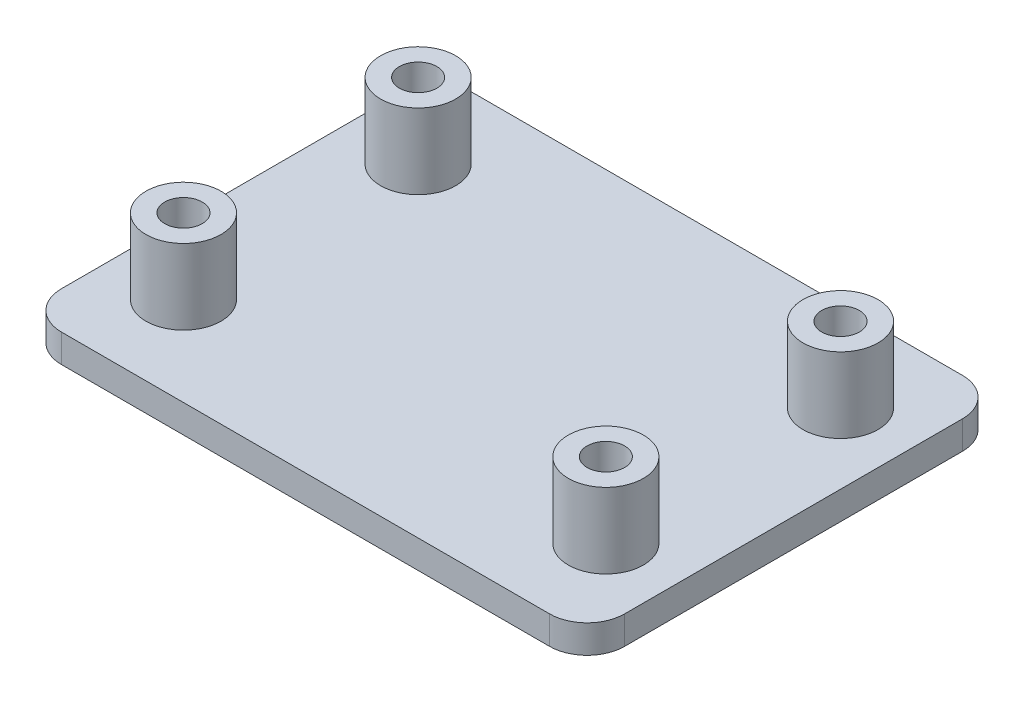
ISO-10303-21;
HEADER;
FILE_DESCRIPTION(('STEP AP214'),'2;1');
FILE_NAME('part.step','',(''),(''),'','','');
FILE_SCHEMA(('AUTOMOTIVE_DESIGN { 1 0 10303 214 1 1 1 1 }'));
ENDSEC;
DATA;
#1=APPLICATION_CONTEXT('core data for automotive mechanical design processes');
#2=APPLICATION_PROTOCOL_DEFINITION('international standard','automotive_design',2000,#1);
#3=PRODUCT_CONTEXT('',#1,'mechanical');
#4=PRODUCT('Part','Part','',(#3));
#5=PRODUCT_RELATED_PRODUCT_CATEGORY('part','',(#4));
#6=PRODUCT_DEFINITION_FORMATION('','',#4);
#7=PRODUCT_DEFINITION_CONTEXT('part definition',#1,'design');
#8=PRODUCT_DEFINITION('design','',#6,#7);
#9=PRODUCT_DEFINITION_SHAPE('','',#8);
#10=(LENGTH_UNIT() NAMED_UNIT(*) SI_UNIT(.MILLI.,.METRE.));
#11=(NAMED_UNIT(*) PLANE_ANGLE_UNIT() SI_UNIT($,.RADIAN.));
#12=(NAMED_UNIT(*) SI_UNIT($,.STERADIAN.) SOLID_ANGLE_UNIT());
#13=UNCERTAINTY_MEASURE_WITH_UNIT(LENGTH_MEASURE(1.E-05),#10,'distance_accuracy_value','');
#14=(GEOMETRIC_REPRESENTATION_CONTEXT(3) GLOBAL_UNCERTAINTY_ASSIGNED_CONTEXT((#13)) GLOBAL_UNIT_ASSIGNED_CONTEXT((#10,
#11,#12)) REPRESENTATION_CONTEXT('',''));
#15=CARTESIAN_POINT('',(0.,0.,0.));
#16=DIRECTION('',(0.,0.,1.));
#17=DIRECTION('',(1.,0.,0.));
#18=AXIS2_PLACEMENT_3D('',#15,#16,#17);
#19=CARTESIAN_POINT('',(-26.,3.,18.));
#20=DIRECTION('',(0.,-1.,0.));
#21=DIRECTION('',(0.,0.,-1.));
#22=AXIS2_PLACEMENT_3D('',#19,#20,#21);
#23=CYLINDRICAL_SURFACE('',#22,4.);
#24=CARTESIAN_POINT('',(-26.,0.,18.));
#25=DIRECTION('',(0.,1.,0.));
#26=DIRECTION('',(0.,0.,1.));
#27=AXIS2_PLACEMENT_3D('',#24,#25,#26);
#28=CIRCLE('',#27,4.);
#29=CARTESIAN_POINT('',(-30.,0.,18.));
#30=VERTEX_POINT('',#29);
#31=CARTESIAN_POINT('',(-26.,0.,22.));
#32=VERTEX_POINT('',#31);
#33=EDGE_CURVE('E135',#30,#32,#28,.T.);
#34=ORIENTED_EDGE('',*,*,#33,.T.);
#35=DIRECTION('',(0.,-1.,0.));
#36=VECTOR('',#35,1.);
#37=CARTESIAN_POINT('',(-26.,3.,22.));
#38=LINE('',#37,#36);
#39=CARTESIAN_POINT('',(-26.,3.,22.));
#40=VERTEX_POINT('',#39);
#41=EDGE_CURVE('E11',#40,#32,#38,.T.);
#42=ORIENTED_EDGE('',*,*,#41,.F.);
#43=CARTESIAN_POINT('',(-26.,3.,18.));
#44=DIRECTION('',(0.,1.,0.));
#45=DIRECTION('',(0.,0.,1.));
#46=AXIS2_PLACEMENT_3D('',#43,#44,#45);
#47=CIRCLE('',#46,4.);
#48=CARTESIAN_POINT('',(-30.,3.,18.));
#49=VERTEX_POINT('',#48);
#50=EDGE_CURVE('E150',#49,#40,#47,.T.);
#51=ORIENTED_EDGE('',*,*,#50,.F.);
#52=DIRECTION('',(0.,-1.,0.));
#53=VECTOR('',#52,1.);
#54=CARTESIAN_POINT('',(-30.,3.,18.));
#55=LINE('',#54,#53);
#56=EDGE_CURVE('E131',#49,#30,#55,.T.);
#57=ORIENTED_EDGE('',*,*,#56,.T.);
#58=EDGE_LOOP('',(#34,#42,#51,#57));
#59=FACE_BOUND('',#58,.T.);
#60=ADVANCED_FACE('F39',(#59),#23,.T.);
#61=CARTESIAN_POINT('',(-26.,3.,22.));
#62=DIRECTION('',(0.,0.,-1.));
#63=DIRECTION('',(-1.,0.,0.));
#64=AXIS2_PLACEMENT_3D('',#61,#62,#63);
#65=PLANE('',#64);
#66=DIRECTION('',(1.,0.,0.));
#67=VECTOR('',#66,1.);
#68=CARTESIAN_POINT('',(-26.,0.,22.));
#69=LINE('',#68,#67);
#70=CARTESIAN_POINT('',(26.,0.,22.));
#71=VERTEX_POINT('',#70);
#72=EDGE_CURVE('E138',#32,#71,#69,.T.);
#73=ORIENTED_EDGE('',*,*,#72,.T.);
#74=DIRECTION('',(0.,-1.,0.));
#75=VECTOR('',#74,1.);
#76=CARTESIAN_POINT('',(26.,3.,22.));
#77=LINE('',#76,#75);
#78=CARTESIAN_POINT('',(26.,3.,22.));
#79=VERTEX_POINT('',#78);
#80=EDGE_CURVE('E47',#79,#71,#77,.T.);
#81=ORIENTED_EDGE('',*,*,#80,.F.);
#82=DIRECTION('',(1.,0.,0.));
#83=VECTOR('',#82,1.);
#84=CARTESIAN_POINT('',(-26.,3.,22.));
#85=LINE('',#84,#83);
#86=EDGE_CURVE('E98',#40,#79,#85,.T.);
#87=ORIENTED_EDGE('',*,*,#86,.F.);
#88=ORIENTED_EDGE('',*,*,#41,.T.);
#89=EDGE_LOOP('',(#73,#81,#87,#88));
#90=FACE_BOUND('',#89,.T.);
#91=ADVANCED_FACE('F267',(#90),#65,.F.);
#92=CARTESIAN_POINT('',(26.,3.,18.));
#93=DIRECTION('',(0.,-1.,0.));
#94=DIRECTION('',(0.,0.,-1.));
#95=AXIS2_PLACEMENT_3D('',#92,#93,#94);
#96=CYLINDRICAL_SURFACE('',#95,4.);
#97=CARTESIAN_POINT('',(26.,0.,18.));
#98=DIRECTION('',(0.,1.,0.));
#99=DIRECTION('',(0.,0.,1.));
#100=AXIS2_PLACEMENT_3D('',#97,#98,#99);
#101=CIRCLE('',#100,4.);
#102=CARTESIAN_POINT('',(30.,0.,18.));
#103=VERTEX_POINT('',#102);
#104=EDGE_CURVE('E141',#71,#103,#101,.T.);
#105=ORIENTED_EDGE('',*,*,#104,.T.);
#106=DIRECTION('',(0.,-1.,0.));
#107=VECTOR('',#106,1.);
#108=CARTESIAN_POINT('',(30.,3.,18.));
#109=LINE('',#108,#107);
#110=CARTESIAN_POINT('',(30.,3.,18.));
#111=VERTEX_POINT('',#110);
#112=EDGE_CURVE('E157',#111,#103,#109,.T.);
#113=ORIENTED_EDGE('',*,*,#112,.F.);
#114=CARTESIAN_POINT('',(26.,3.,18.));
#115=DIRECTION('',(0.,1.,0.));
#116=DIRECTION('',(0.,0.,1.));
#117=AXIS2_PLACEMENT_3D('',#114,#115,#116);
#118=CIRCLE('',#117,4.);
#119=EDGE_CURVE('E165',#79,#111,#118,.T.);
#120=ORIENTED_EDGE('',*,*,#119,.F.);
#121=ORIENTED_EDGE('',*,*,#80,.T.);
#122=EDGE_LOOP('',(#105,#113,#120,#121));
#123=FACE_BOUND('',#122,.T.);
#124=ADVANCED_FACE('F163',(#123),#96,.T.);
#125=CARTESIAN_POINT('',(30.,3.,18.));
#126=DIRECTION('',(-1.,0.,0.));
#127=DIRECTION('',(0.,0.,1.));
#128=AXIS2_PLACEMENT_3D('',#125,#126,#127);
#129=PLANE('',#128);
#130=DIRECTION('',(0.,0.,-1.));
#131=VECTOR('',#130,1.);
#132=CARTESIAN_POINT('',(30.,0.,18.));
#133=LINE('',#132,#131);
#134=CARTESIAN_POINT('',(30.,0.,-18.));
#135=VERTEX_POINT('',#134);
#136=EDGE_CURVE('E143',#103,#135,#133,.T.);
#137=ORIENTED_EDGE('',*,*,#136,.T.);
#138=DIRECTION('',(0.,-1.,0.));
#139=VECTOR('',#138,1.);
#140=CARTESIAN_POINT('',(30.,3.,-18.));
#141=LINE('',#140,#139);
#142=CARTESIAN_POINT('',(30.,3.,-18.));
#143=VERTEX_POINT('',#142);
#144=EDGE_CURVE('E154',#143,#135,#141,.T.);
#145=ORIENTED_EDGE('',*,*,#144,.F.);
#146=DIRECTION('',(0.,0.,-1.));
#147=VECTOR('',#146,1.);
#148=CARTESIAN_POINT('',(30.,3.,18.));
#149=LINE('',#148,#147);
#150=EDGE_CURVE('E177',#111,#143,#149,.T.);
#151=ORIENTED_EDGE('',*,*,#150,.F.);
#152=ORIENTED_EDGE('',*,*,#112,.T.);
#153=EDGE_LOOP('',(#137,#145,#151,#152));
#154=FACE_BOUND('',#153,.T.);
#155=ADVANCED_FACE('F173',(#154),#129,.F.);
#156=CARTESIAN_POINT('',(26.,3.,-18.));
#157=DIRECTION('',(0.,-1.,0.));
#158=DIRECTION('',(0.,0.,-1.));
#159=AXIS2_PLACEMENT_3D('',#156,#157,#158);
#160=CYLINDRICAL_SURFACE('',#159,4.);
#161=CARTESIAN_POINT('',(26.,0.,-18.));
#162=DIRECTION('',(0.,1.,0.));
#163=DIRECTION('',(0.,0.,1.));
#164=AXIS2_PLACEMENT_3D('',#161,#162,#163);
#165=CIRCLE('',#164,4.);
#166=CARTESIAN_POINT('',(26.,0.,-22.));
#167=VERTEX_POINT('',#166);
#168=EDGE_CURVE('E145',#135,#167,#165,.T.);
#169=ORIENTED_EDGE('',*,*,#168,.T.);
#170=DIRECTION('',(0.,-1.,0.));
#171=VECTOR('',#170,1.);
#172=CARTESIAN_POINT('',(26.,3.,-22.));
#173=LINE('',#172,#171);
#174=CARTESIAN_POINT('',(26.,3.,-22.));
#175=VERTEX_POINT('',#174);
#176=EDGE_CURVE('E126',#175,#167,#173,.T.);
#177=ORIENTED_EDGE('',*,*,#176,.F.);
#178=CARTESIAN_POINT('',(26.,3.,-18.));
#179=DIRECTION('',(0.,1.,0.));
#180=DIRECTION('',(0.,0.,1.));
#181=AXIS2_PLACEMENT_3D('',#178,#179,#180);
#182=CIRCLE('',#181,4.);
#183=EDGE_CURVE('E117',#143,#175,#182,.T.);
#184=ORIENTED_EDGE('',*,*,#183,.F.);
#185=ORIENTED_EDGE('',*,*,#144,.T.);
#186=EDGE_LOOP('',(#169,#177,#184,#185));
#187=FACE_BOUND('',#186,.T.);
#188=ADVANCED_FACE('F176',(#187),#160,.T.);
#189=CARTESIAN_POINT('',(26.,3.,-22.));
#190=DIRECTION('',(0.,0.,1.));
#191=DIRECTION('',(1.,0.,0.));
#192=AXIS2_PLACEMENT_3D('',#189,#190,#191);
#193=PLANE('',#192);
#194=DIRECTION('',(-1.,0.,0.));
#195=VECTOR('',#194,1.);
#196=CARTESIAN_POINT('',(26.,0.,-22.));
#197=LINE('',#196,#195);
#198=CARTESIAN_POINT('',(-26.,0.,-22.));
#199=VERTEX_POINT('',#198);
#200=EDGE_CURVE('E125',#167,#199,#197,.T.);
#201=ORIENTED_EDGE('',*,*,#200,.T.);
#202=DIRECTION('',(0.,-1.,0.));
#203=VECTOR('',#202,1.);
#204=CARTESIAN_POINT('',(-26.,3.,-22.));
#205=LINE('',#204,#203);
#206=CARTESIAN_POINT('',(-26.,3.,-22.));
#207=VERTEX_POINT('',#206);
#208=EDGE_CURVE('E122',#207,#199,#205,.T.);
#209=ORIENTED_EDGE('',*,*,#208,.F.);
#210=DIRECTION('',(-1.,0.,0.));
#211=VECTOR('',#210,1.);
#212=CARTESIAN_POINT('',(26.,3.,-22.));
#213=LINE('',#212,#211);
#214=EDGE_CURVE('E111',#175,#207,#213,.T.);
#215=ORIENTED_EDGE('',*,*,#214,.F.);
#216=ORIENTED_EDGE('',*,*,#176,.T.);
#217=EDGE_LOOP('',(#201,#209,#215,#216));
#218=FACE_BOUND('',#217,.T.);
#219=ADVANCED_FACE('F123',(#218),#193,.F.);
#220=CARTESIAN_POINT('',(-26.,3.,-18.));
#221=DIRECTION('',(0.,-1.,0.));
#222=DIRECTION('',(0.,0.,-1.));
#223=AXIS2_PLACEMENT_3D('',#220,#221,#222);
#224=CYLINDRICAL_SURFACE('',#223,4.);
#225=CARTESIAN_POINT('',(-26.,0.,-18.));
#226=DIRECTION('',(0.,1.,0.));
#227=DIRECTION('',(0.,0.,1.));
#228=AXIS2_PLACEMENT_3D('',#225,#226,#227);
#229=CIRCLE('',#228,4.);
#230=CARTESIAN_POINT('',(-30.,0.,-18.));
#231=VERTEX_POINT('',#230);
#232=EDGE_CURVE('E84',#199,#231,#229,.T.);
#233=ORIENTED_EDGE('',*,*,#232,.T.);
#234=DIRECTION('',(0.,-1.,0.));
#235=VECTOR('',#234,1.);
#236=CARTESIAN_POINT('',(-30.,3.,-18.));
#237=LINE('',#236,#235);
#238=CARTESIAN_POINT('',(-30.,3.,-18.));
#239=VERTEX_POINT('',#238);
#240=EDGE_CURVE('E127',#239,#231,#237,.T.);
#241=ORIENTED_EDGE('',*,*,#240,.F.);
#242=CARTESIAN_POINT('',(-26.,3.,-18.));
#243=DIRECTION('',(0.,1.,0.));
#244=DIRECTION('',(0.,0.,1.));
#245=AXIS2_PLACEMENT_3D('',#242,#243,#244);
#246=CIRCLE('',#245,4.);
#247=EDGE_CURVE('E115',#207,#239,#246,.T.);
#248=ORIENTED_EDGE('',*,*,#247,.F.);
#249=ORIENTED_EDGE('',*,*,#208,.T.);
#250=EDGE_LOOP('',(#233,#241,#248,#249));
#251=FACE_BOUND('',#250,.T.);
#252=ADVANCED_FACE('F129',(#251),#224,.T.);
#253=CARTESIAN_POINT('',(-30.,3.,-18.));
#254=DIRECTION('',(1.,0.,0.));
#255=DIRECTION('',(0.,0.,-1.));
#256=AXIS2_PLACEMENT_3D('',#253,#254,#255);
#257=PLANE('',#256);
#258=DIRECTION('',(0.,0.,1.));
#259=VECTOR('',#258,1.);
#260=CARTESIAN_POINT('',(-30.,0.,-18.));
#261=LINE('',#260,#259);
#262=EDGE_CURVE('E90',#231,#30,#261,.T.);
#263=ORIENTED_EDGE('',*,*,#262,.T.);
#264=ORIENTED_EDGE('',*,*,#56,.F.);
#265=DIRECTION('',(0.,0.,1.));
#266=VECTOR('',#265,1.);
#267=CARTESIAN_POINT('',(-30.,3.,-18.));
#268=LINE('',#267,#266);
#269=EDGE_CURVE('E55',#239,#49,#268,.T.);
#270=ORIENTED_EDGE('',*,*,#269,.F.);
#271=ORIENTED_EDGE('',*,*,#240,.T.);
#272=EDGE_LOOP('',(#263,#264,#270,#271));
#273=FACE_BOUND('',#272,.T.);
#274=ADVANCED_FACE('F249',(#273),#257,.F.);
#275=CARTESIAN_POINT('',(-26.,3.,18.));
#276=DIRECTION('',(0.,1.,0.));
#277=DIRECTION('',(0.,0.,1.));
#278=AXIS2_PLACEMENT_3D('',#275,#276,#277);
#279=PLANE('',#278);
#280=CARTESIAN_POINT('',(22.5,3.,-12.5));
#281=DIRECTION('',(0.,1.,0.));
#282=DIRECTION('',(0.,0.,1.));
#283=AXIS2_PLACEMENT_3D('',#280,#281,#282);
#284=CIRCLE('',#283,4.);
#285=CARTESIAN_POINT('',(22.5,3.,-8.5));
#286=VERTEX_POINT('',#285);
#287=EDGE_CURVE('E186',#286,#286,#284,.T.);
#288=ORIENTED_EDGE('',*,*,#287,.F.);
#289=EDGE_LOOP('',(#288));
#290=FACE_BOUND('',#289,.T.);
#291=CARTESIAN_POINT('',(-22.5,3.,12.5));
#292=DIRECTION('',(0.,1.,0.));
#293=DIRECTION('',(0.,0.,1.));
#294=AXIS2_PLACEMENT_3D('',#291,#292,#293);
#295=CIRCLE('',#294,4.);
#296=CARTESIAN_POINT('',(-22.5,3.,16.5));
#297=VERTEX_POINT('',#296);
#298=EDGE_CURVE('E192',#297,#297,#295,.T.);
#299=ORIENTED_EDGE('',*,*,#298,.F.);
#300=EDGE_LOOP('',(#299));
#301=FACE_BOUND('',#300,.T.);
#302=CARTESIAN_POINT('',(-22.5,3.,-12.5));
#303=DIRECTION('',(0.,1.,0.));
#304=DIRECTION('',(0.,0.,1.));
#305=AXIS2_PLACEMENT_3D('',#302,#303,#304);
#306=CIRCLE('',#305,4.);
#307=CARTESIAN_POINT('',(-22.5,3.,-8.5));
#308=VERTEX_POINT('',#307);
#309=EDGE_CURVE('E193',#308,#308,#306,.T.);
#310=ORIENTED_EDGE('',*,*,#309,.F.);
#311=EDGE_LOOP('',(#310));
#312=FACE_BOUND('',#311,.T.);
#313=CARTESIAN_POINT('',(22.5,3.,12.5));
#314=DIRECTION('',(0.,1.,0.));
#315=DIRECTION('',(0.,0.,1.));
#316=AXIS2_PLACEMENT_3D('',#313,#314,#315);
#317=CIRCLE('',#316,4.);
#318=CARTESIAN_POINT('',(22.5,3.,16.5));
#319=VERTEX_POINT('',#318);
#320=EDGE_CURVE('E183',#319,#319,#317,.T.);
#321=ORIENTED_EDGE('',*,*,#320,.F.);
#322=EDGE_LOOP('',(#321));
#323=FACE_BOUND('',#322,.T.);
#324=ORIENTED_EDGE('',*,*,#50,.T.);
#325=ORIENTED_EDGE('',*,*,#86,.T.);
#326=ORIENTED_EDGE('',*,*,#119,.T.);
#327=ORIENTED_EDGE('',*,*,#150,.T.);
#328=ORIENTED_EDGE('',*,*,#183,.T.);
#329=ORIENTED_EDGE('',*,*,#214,.T.);
#330=ORIENTED_EDGE('',*,*,#247,.T.);
#331=ORIENTED_EDGE('',*,*,#269,.T.);
#332=EDGE_LOOP('',(#324,#325,#326,#327,#328,#329,#330,#331));
#333=FACE_BOUND('',#332,.T.);
#334=ADVANCED_FACE('F113',(#290,#301,#312,#323,#333),#279,.T.);
#335=CARTESIAN_POINT('',(-26.,0.,18.));
#336=DIRECTION('',(0.,1.,0.));
#337=DIRECTION('',(0.,0.,1.));
#338=AXIS2_PLACEMENT_3D('',#335,#336,#337);
#339=PLANE('',#338);
#340=ORIENTED_EDGE('',*,*,#33,.F.);
#341=ORIENTED_EDGE('',*,*,#262,.F.);
#342=ORIENTED_EDGE('',*,*,#232,.F.);
#343=ORIENTED_EDGE('',*,*,#200,.F.);
#344=ORIENTED_EDGE('',*,*,#168,.F.);
#345=ORIENTED_EDGE('',*,*,#136,.F.);
#346=ORIENTED_EDGE('',*,*,#104,.F.);
#347=ORIENTED_EDGE('',*,*,#72,.F.);
#348=EDGE_LOOP('',(#340,#341,#342,#343,#344,#345,#346,#347));
#349=FACE_BOUND('',#348,.T.);
#350=ADVANCED_FACE('F169',(#349),#339,.F.);
#351=CARTESIAN_POINT('',(22.5,11.,12.5));
#352=DIRECTION('',(0.,-1.,0.));
#353=DIRECTION('',(0.,0.,-1.));
#354=AXIS2_PLACEMENT_3D('',#351,#352,#353);
#355=CYLINDRICAL_SURFACE('',#354,4.);
#356=CARTESIAN_POINT('',(22.5,11.,12.5));
#357=DIRECTION('',(0.,1.,0.));
#358=DIRECTION('',(0.,0.,1.));
#359=AXIS2_PLACEMENT_3D('',#356,#357,#358);
#360=CIRCLE('',#359,4.);
#361=CARTESIAN_POINT('',(22.5,11.,16.5));
#362=VERTEX_POINT('',#361);
#363=EDGE_CURVE('E139',#362,#362,#360,.T.);
#364=ORIENTED_EDGE('',*,*,#363,.F.);
#365=EDGE_LOOP('',(#364));
#366=FACE_BOUND('',#365,.T.);
#367=ORIENTED_EDGE('',*,*,#320,.T.);
#368=EDGE_LOOP('',(#367));
#369=FACE_BOUND('',#368,.T.);
#370=ADVANCED_FACE('F254',(#366,#369),#355,.T.);
#371=CARTESIAN_POINT('',(22.5,11.,12.5));
#372=DIRECTION('',(0.,1.,0.));
#373=DIRECTION('',(0.,0.,1.));
#374=AXIS2_PLACEMENT_3D('',#371,#372,#373);
#375=PLANE('',#374);
#376=CARTESIAN_POINT('',(22.5,11.,12.5));
#377=DIRECTION('',(0.,1.,0.));
#378=DIRECTION('',(0.,0.,1.));
#379=AXIS2_PLACEMENT_3D('',#376,#377,#378);
#380=CIRCLE('',#379,2.);
#381=CARTESIAN_POINT('',(22.5,11.,14.5));
#382=VERTEX_POINT('',#381);
#383=EDGE_CURVE('E207',#382,#382,#380,.T.);
#384=ORIENTED_EDGE('',*,*,#383,.F.);
#385=EDGE_LOOP('',(#384));
#386=FACE_BOUND('',#385,.T.);
#387=ORIENTED_EDGE('',*,*,#363,.T.);
#388=EDGE_LOOP('',(#387));
#389=FACE_BOUND('',#388,.T.);
#390=ADVANCED_FACE('F243',(#386,#389),#375,.T.);
#391=CARTESIAN_POINT('',(-22.5,11.,-12.5));
#392=DIRECTION('',(0.,-1.,0.));
#393=DIRECTION('',(0.,0.,-1.));
#394=AXIS2_PLACEMENT_3D('',#391,#392,#393);
#395=CYLINDRICAL_SURFACE('',#394,4.);
#396=CARTESIAN_POINT('',(-22.5,11.,-12.5));
#397=DIRECTION('',(0.,1.,0.));
#398=DIRECTION('',(0.,0.,1.));
#399=AXIS2_PLACEMENT_3D('',#396,#397,#398);
#400=CIRCLE('',#399,4.);
#401=CARTESIAN_POINT('',(-22.5,11.,-8.5));
#402=VERTEX_POINT('',#401);
#403=EDGE_CURVE('E201',#402,#402,#400,.T.);
#404=ORIENTED_EDGE('',*,*,#403,.F.);
#405=EDGE_LOOP('',(#404));
#406=FACE_BOUND('',#405,.T.);
#407=ORIENTED_EDGE('',*,*,#309,.T.);
#408=EDGE_LOOP('',(#407));
#409=FACE_BOUND('',#408,.T.);
#410=ADVANCED_FACE('F237',(#406,#409),#395,.T.);
#411=CARTESIAN_POINT('',(-22.5,11.,-12.5));
#412=DIRECTION('',(0.,1.,0.));
#413=DIRECTION('',(0.,0.,1.));
#414=AXIS2_PLACEMENT_3D('',#411,#412,#413);
#415=PLANE('',#414);
#416=CARTESIAN_POINT('',(-22.5,11.,-12.5));
#417=DIRECTION('',(0.,1.,0.));
#418=DIRECTION('',(0.,0.,1.));
#419=AXIS2_PLACEMENT_3D('',#416,#417,#418);
#420=CIRCLE('',#419,2.);
#421=CARTESIAN_POINT('',(-22.5,11.,-10.5));
#422=VERTEX_POINT('',#421);
#423=EDGE_CURVE('E217',#422,#422,#420,.T.);
#424=ORIENTED_EDGE('',*,*,#423,.F.);
#425=EDGE_LOOP('',(#424));
#426=FACE_BOUND('',#425,.T.);
#427=ORIENTED_EDGE('',*,*,#403,.T.);
#428=EDGE_LOOP('',(#427));
#429=FACE_BOUND('',#428,.T.);
#430=ADVANCED_FACE('F233',(#426,#429),#415,.T.);
#431=CARTESIAN_POINT('',(-22.5,11.,12.5));
#432=DIRECTION('',(0.,-1.,0.));
#433=DIRECTION('',(0.,0.,-1.));
#434=AXIS2_PLACEMENT_3D('',#431,#432,#433);
#435=CYLINDRICAL_SURFACE('',#434,4.);
#436=CARTESIAN_POINT('',(-22.5,11.,12.5));
#437=DIRECTION('',(0.,1.,0.));
#438=DIRECTION('',(0.,0.,1.));
#439=AXIS2_PLACEMENT_3D('',#436,#437,#438);
#440=CIRCLE('',#439,4.);
#441=CARTESIAN_POINT('',(-22.5,11.,16.5));
#442=VERTEX_POINT('',#441);
#443=EDGE_CURVE('E189',#442,#442,#440,.T.);
#444=ORIENTED_EDGE('',*,*,#443,.F.);
#445=EDGE_LOOP('',(#444));
#446=FACE_BOUND('',#445,.T.);
#447=ORIENTED_EDGE('',*,*,#298,.T.);
#448=EDGE_LOOP('',(#447));
#449=FACE_BOUND('',#448,.T.);
#450=ADVANCED_FACE('F236',(#446,#449),#435,.T.);
#451=CARTESIAN_POINT('',(-22.5,11.,12.5));
#452=DIRECTION('',(0.,1.,0.));
#453=DIRECTION('',(0.,0.,1.));
#454=AXIS2_PLACEMENT_3D('',#451,#452,#453);
#455=PLANE('',#454);
#456=CARTESIAN_POINT('',(-22.5,11.,12.5));
#457=DIRECTION('',(0.,1.,0.));
#458=DIRECTION('',(0.,0.,1.));
#459=AXIS2_PLACEMENT_3D('',#456,#457,#458);
#460=CIRCLE('',#459,2.);
#461=CARTESIAN_POINT('',(-22.5,11.,14.5));
#462=VERTEX_POINT('',#461);
#463=EDGE_CURVE('E216',#462,#462,#460,.T.);
#464=ORIENTED_EDGE('',*,*,#463,.F.);
#465=EDGE_LOOP('',(#464));
#466=FACE_BOUND('',#465,.T.);
#467=ORIENTED_EDGE('',*,*,#443,.T.);
#468=EDGE_LOOP('',(#467));
#469=FACE_BOUND('',#468,.T.);
#470=ADVANCED_FACE('F362',(#466,#469),#455,.T.);
#471=CARTESIAN_POINT('',(22.5,11.,-12.5));
#472=DIRECTION('',(0.,-1.,0.));
#473=DIRECTION('',(0.,0.,-1.));
#474=AXIS2_PLACEMENT_3D('',#471,#472,#473);
#475=CYLINDRICAL_SURFACE('',#474,4.);
#476=CARTESIAN_POINT('',(22.5,11.,-12.5));
#477=DIRECTION('',(0.,1.,0.));
#478=DIRECTION('',(0.,0.,1.));
#479=AXIS2_PLACEMENT_3D('',#476,#477,#478);
#480=CIRCLE('',#479,4.);
#481=CARTESIAN_POINT('',(22.5,11.,-8.5));
#482=VERTEX_POINT('',#481);
#483=EDGE_CURVE('E196',#482,#482,#480,.T.);
#484=ORIENTED_EDGE('',*,*,#483,.F.);
#485=EDGE_LOOP('',(#484));
#486=FACE_BOUND('',#485,.T.);
#487=ORIENTED_EDGE('',*,*,#287,.T.);
#488=EDGE_LOOP('',(#487));
#489=FACE_BOUND('',#488,.T.);
#490=ADVANCED_FACE('F371',(#486,#489),#475,.T.);
#491=CARTESIAN_POINT('',(22.5,11.,-12.5));
#492=DIRECTION('',(0.,1.,0.));
#493=DIRECTION('',(0.,0.,1.));
#494=AXIS2_PLACEMENT_3D('',#491,#492,#493);
#495=PLANE('',#494);
#496=CARTESIAN_POINT('',(22.5,11.,-12.5));
#497=DIRECTION('',(0.,1.,0.));
#498=DIRECTION('',(0.,0.,1.));
#499=AXIS2_PLACEMENT_3D('',#496,#497,#498);
#500=CIRCLE('',#499,2.);
#501=CARTESIAN_POINT('',(22.5,11.,-10.5));
#502=VERTEX_POINT('',#501);
#503=EDGE_CURVE('E210',#502,#502,#500,.T.);
#504=ORIENTED_EDGE('',*,*,#503,.F.);
#505=EDGE_LOOP('',(#504));
#506=FACE_BOUND('',#505,.T.);
#507=ORIENTED_EDGE('',*,*,#483,.T.);
#508=EDGE_LOOP('',(#507));
#509=FACE_BOUND('',#508,.T.);
#510=ADVANCED_FACE('F381',(#506,#509),#495,.T.);
#511=CARTESIAN_POINT('',(22.5,4.,-12.5));
#512=DIRECTION('',(0.,1.,0.));
#513=DIRECTION('',(0.,0.,1.));
#514=AXIS2_PLACEMENT_3D('',#511,#512,#513);
#515=CYLINDRICAL_SURFACE('',#514,2.);
#516=CARTESIAN_POINT('',(22.5,4.,-12.5));
#517=DIRECTION('',(0.,1.,0.));
#518=DIRECTION('',(0.,0.,1.));
#519=AXIS2_PLACEMENT_3D('',#516,#517,#518);
#520=CIRCLE('',#519,2.);
#521=CARTESIAN_POINT('',(22.5,4.,-10.5));
#522=VERTEX_POINT('',#521);
#523=EDGE_CURVE('E220',#522,#522,#520,.T.);
#524=ORIENTED_EDGE('',*,*,#523,.F.);
#525=EDGE_LOOP('',(#524));
#526=FACE_BOUND('',#525,.T.);
#527=ORIENTED_EDGE('',*,*,#503,.T.);
#528=EDGE_LOOP('',(#527));
#529=FACE_BOUND('',#528,.T.);
#530=ADVANCED_FACE('F390',(#526,#529),#515,.F.);
#531=CARTESIAN_POINT('',(22.5,4.,-12.5));
#532=DIRECTION('',(0.,1.,0.));
#533=DIRECTION('',(0.,0.,1.));
#534=AXIS2_PLACEMENT_3D('',#531,#532,#533);
#535=PLANE('',#534);
#536=ORIENTED_EDGE('',*,*,#523,.T.);
#537=EDGE_LOOP('',(#536));
#538=FACE_BOUND('',#537,.T.);
#539=ADVANCED_FACE('F400',(#538),#535,.T.);
#540=CARTESIAN_POINT('',(-22.5,4.,12.5));
#541=DIRECTION('',(0.,1.,0.));
#542=DIRECTION('',(0.,0.,1.));
#543=AXIS2_PLACEMENT_3D('',#540,#541,#542);
#544=CYLINDRICAL_SURFACE('',#543,2.);
#545=CARTESIAN_POINT('',(-22.5,4.,12.5));
#546=DIRECTION('',(0.,1.,0.));
#547=DIRECTION('',(0.,0.,1.));
#548=AXIS2_PLACEMENT_3D('',#545,#546,#547);
#549=CIRCLE('',#548,2.);
#550=CARTESIAN_POINT('',(-22.5,4.,14.5));
#551=VERTEX_POINT('',#550);
#552=EDGE_CURVE('E213',#551,#551,#549,.T.);
#553=ORIENTED_EDGE('',*,*,#552,.F.);
#554=EDGE_LOOP('',(#553));
#555=FACE_BOUND('',#554,.T.);
#556=ORIENTED_EDGE('',*,*,#463,.T.);
#557=EDGE_LOOP('',(#556));
#558=FACE_BOUND('',#557,.T.);
#559=ADVANCED_FACE('F410',(#555,#558),#544,.F.);
#560=CARTESIAN_POINT('',(-22.5,4.,12.5));
#561=DIRECTION('',(0.,1.,0.));
#562=DIRECTION('',(0.,0.,1.));
#563=AXIS2_PLACEMENT_3D('',#560,#561,#562);
#564=PLANE('',#563);
#565=ORIENTED_EDGE('',*,*,#552,.T.);
#566=EDGE_LOOP('',(#565));
#567=FACE_BOUND('',#566,.T.);
#568=ADVANCED_FACE('F420',(#567),#564,.T.);
#569=CARTESIAN_POINT('',(-22.5,4.,-12.5));
#570=DIRECTION('',(0.,1.,0.));
#571=DIRECTION('',(0.,0.,1.));
#572=AXIS2_PLACEMENT_3D('',#569,#570,#571);
#573=CYLINDRICAL_SURFACE('',#572,2.);
#574=CARTESIAN_POINT('',(-22.5,4.,-12.5));
#575=DIRECTION('',(0.,1.,0.));
#576=DIRECTION('',(0.,0.,1.));
#577=AXIS2_PLACEMENT_3D('',#574,#575,#576);
#578=CIRCLE('',#577,2.);
#579=CARTESIAN_POINT('',(-22.5,4.,-10.5));
#580=VERTEX_POINT('',#579);
#581=EDGE_CURVE('E225',#580,#580,#578,.T.);
#582=ORIENTED_EDGE('',*,*,#581,.F.);
#583=EDGE_LOOP('',(#582));
#584=FACE_BOUND('',#583,.T.);
#585=ORIENTED_EDGE('',*,*,#423,.T.);
#586=EDGE_LOOP('',(#585));
#587=FACE_BOUND('',#586,.T.);
#588=ADVANCED_FACE('F231',(#584,#587),#573,.F.);
#589=CARTESIAN_POINT('',(-22.5,4.,-12.5));
#590=DIRECTION('',(0.,1.,0.));
#591=DIRECTION('',(0.,0.,1.));
#592=AXIS2_PLACEMENT_3D('',#589,#590,#591);
#593=PLANE('',#592);
#594=ORIENTED_EDGE('',*,*,#581,.T.);
#595=EDGE_LOOP('',(#594));
#596=FACE_BOUND('',#595,.T.);
#597=ADVANCED_FACE('F439',(#596),#593,.T.);
#598=CARTESIAN_POINT('',(22.5,4.,12.5));
#599=DIRECTION('',(0.,1.,0.));
#600=DIRECTION('',(0.,0.,1.));
#601=AXIS2_PLACEMENT_3D('',#598,#599,#600);
#602=CYLINDRICAL_SURFACE('',#601,2.);
#603=CARTESIAN_POINT('',(22.5,4.,12.5));
#604=DIRECTION('',(0.,1.,0.));
#605=DIRECTION('',(0.,0.,1.));
#606=AXIS2_PLACEMENT_3D('',#603,#604,#605);
#607=CIRCLE('',#606,2.);
#608=CARTESIAN_POINT('',(22.5,4.,14.5));
#609=VERTEX_POINT('',#608);
#610=EDGE_CURVE('E204',#609,#609,#607,.T.);
#611=ORIENTED_EDGE('',*,*,#610,.F.);
#612=EDGE_LOOP('',(#611));
#613=FACE_BOUND('',#612,.T.);
#614=ORIENTED_EDGE('',*,*,#383,.T.);
#615=EDGE_LOOP('',(#614));
#616=FACE_BOUND('',#615,.T.);
#617=ADVANCED_FACE('F449',(#613,#616),#602,.F.);
#618=CARTESIAN_POINT('',(22.5,4.,12.5));
#619=DIRECTION('',(0.,1.,0.));
#620=DIRECTION('',(0.,0.,1.));
#621=AXIS2_PLACEMENT_3D('',#618,#619,#620);
#622=PLANE('',#621);
#623=ORIENTED_EDGE('',*,*,#610,.T.);
#624=EDGE_LOOP('',(#623));
#625=FACE_BOUND('',#624,.T.);
#626=ADVANCED_FACE('F459',(#625),#622,.T.);
#627=CLOSED_SHELL('',(#60,#91,#124,#155,#188,#219,#252,#274,#334,#350,#370,#390,#410,#430,#450,
#470,#490,#510,#530,#539,#559,#568,#588,#597,#617,#626));
#628=MANIFOLD_SOLID_BREP('B2',#627);
#629=ADVANCED_BREP_SHAPE_REPRESENTATION('',(#18,#628),#14);
#630=SHAPE_DEFINITION_REPRESENTATION(#9,#629);
ENDSEC;
END-ISO-10303-21;
